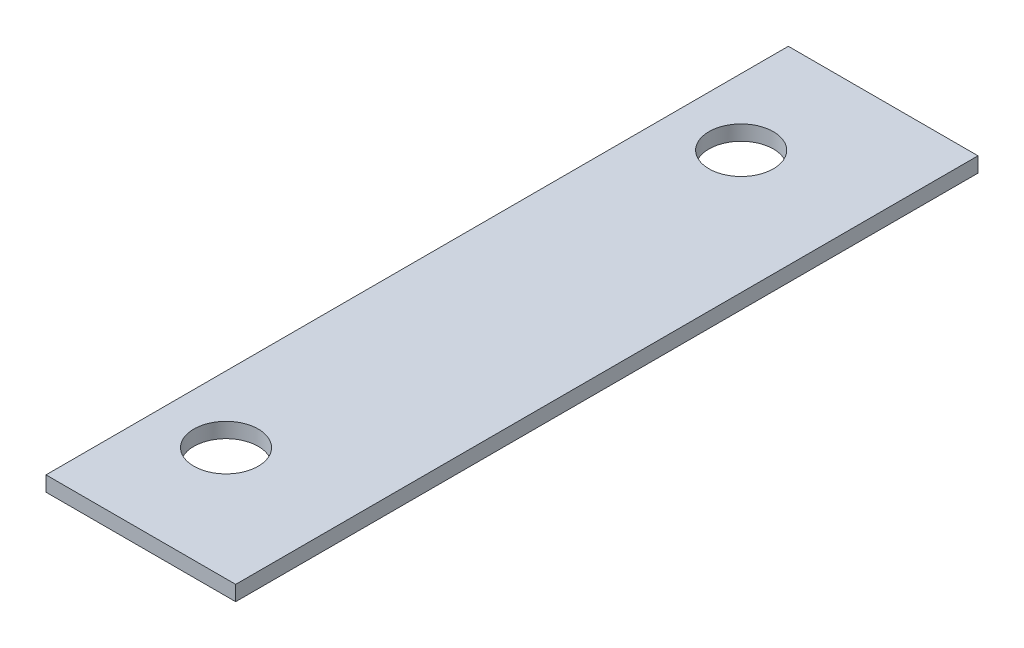
ISO-10303-21;
HEADER;
FILE_DESCRIPTION(('STEP AP214'),'2;1');
FILE_NAME('part.step','',(''),(''),'','','');
FILE_SCHEMA(('AUTOMOTIVE_DESIGN { 1 0 10303 214 1 1 1 1 }'));
ENDSEC;
DATA;
#1=APPLICATION_CONTEXT('core data for automotive mechanical design processes');
#2=APPLICATION_PROTOCOL_DEFINITION('international standard','automotive_design',2000,#1);
#3=PRODUCT_CONTEXT('',#1,'mechanical');
#4=PRODUCT('Part','Part','',(#3));
#5=PRODUCT_RELATED_PRODUCT_CATEGORY('part','',(#4));
#6=PRODUCT_DEFINITION_FORMATION('','',#4);
#7=PRODUCT_DEFINITION_CONTEXT('part definition',#1,'design');
#8=PRODUCT_DEFINITION('design','',#6,#7);
#9=PRODUCT_DEFINITION_SHAPE('','',#8);
#10=(LENGTH_UNIT() NAMED_UNIT(*) SI_UNIT(.MILLI.,.METRE.));
#11=(NAMED_UNIT(*) PLANE_ANGLE_UNIT() SI_UNIT($,.RADIAN.));
#12=(NAMED_UNIT(*) SI_UNIT($,.STERADIAN.) SOLID_ANGLE_UNIT());
#13=UNCERTAINTY_MEASURE_WITH_UNIT(LENGTH_MEASURE(1.E-05),#10,'distance_accuracy_value','');
#14=(GEOMETRIC_REPRESENTATION_CONTEXT(3) GLOBAL_UNCERTAINTY_ASSIGNED_CONTEXT((#13)) GLOBAL_UNIT_ASSIGNED_CONTEXT((#10,
#11,#12)) REPRESENTATION_CONTEXT('',''));
#15=CARTESIAN_POINT('',(0.,0.,0.));
#16=DIRECTION('',(0.,0.,1.));
#17=DIRECTION('',(1.,0.,0.));
#18=AXIS2_PLACEMENT_3D('',#15,#16,#17);
#19=CARTESIAN_POINT('',(0.,0.79375,0.));
#20=DIRECTION('',(1.,0.,0.));
#21=DIRECTION('',(0.,0.,-1.));
#22=AXIS2_PLACEMENT_3D('',#19,#20,#21);
#23=PLANE('',#22);
#24=DIRECTION('',(0.,0.,1.));
#25=VECTOR('',#24,1.);
#26=CARTESIAN_POINT('',(0.,0.,0.));
#27=LINE('',#26,#25);
#28=CARTESIAN_POINT('',(0.,0.,-39.1668));
#29=VERTEX_POINT('',#28);
#30=CARTESIAN_POINT('',(0.,0.,0.));
#31=VERTEX_POINT('',#30);
#32=EDGE_CURVE('E82',#29,#31,#27,.T.);
#33=ORIENTED_EDGE('',*,*,#32,.T.);
#34=DIRECTION('',(0.,-1.,0.));
#35=VECTOR('',#34,1.);
#36=CARTESIAN_POINT('',(0.,0.79375,0.));
#37=LINE('',#36,#35);
#38=CARTESIAN_POINT('',(0.,0.79375,0.));
#39=VERTEX_POINT('',#38);
#40=EDGE_CURVE('E11',#39,#31,#37,.T.);
#41=ORIENTED_EDGE('',*,*,#40,.F.);
#42=DIRECTION('',(0.,0.,1.));
#43=VECTOR('',#42,1.);
#44=CARTESIAN_POINT('',(0.,0.79375,0.));
#45=LINE('',#44,#43);
#46=CARTESIAN_POINT('',(0.,0.79375,-39.1668));
#47=VERTEX_POINT('',#46);
#48=EDGE_CURVE('E69',#47,#39,#45,.T.);
#49=ORIENTED_EDGE('',*,*,#48,.F.);
#50=DIRECTION('',(0.,-1.,0.));
#51=VECTOR('',#50,1.);
#52=CARTESIAN_POINT('',(0.,0.79375,-39.1668));
#53=LINE('',#52,#51);
#54=EDGE_CURVE('E78',#47,#29,#53,.T.);
#55=ORIENTED_EDGE('',*,*,#54,.T.);
#56=EDGE_LOOP('',(#33,#41,#49,#55));
#57=FACE_BOUND('',#56,.T.);
#58=ADVANCED_FACE('F17',(#57),#23,.F.);
#59=CARTESIAN_POINT('',(0.,0.79375,0.));
#60=DIRECTION('',(0.,0.,-1.));
#61=DIRECTION('',(-1.,0.,0.));
#62=AXIS2_PLACEMENT_3D('',#59,#60,#61);
#63=PLANE('',#62);
#64=DIRECTION('',(1.,0.,0.));
#65=VECTOR('',#64,1.);
#66=CARTESIAN_POINT('',(0.,0.,0.));
#67=LINE('',#66,#65);
#68=CARTESIAN_POINT('',(10.0076,0.,0.));
#69=VERTEX_POINT('',#68);
#70=EDGE_CURVE('E73',#31,#69,#67,.T.);
#71=ORIENTED_EDGE('',*,*,#70,.T.);
#72=DIRECTION('',(0.,-1.,0.));
#73=VECTOR('',#72,1.);
#74=CARTESIAN_POINT('',(10.0076,0.79375,0.));
#75=LINE('',#74,#73);
#76=CARTESIAN_POINT('',(10.0076,0.79375,0.));
#77=VERTEX_POINT('',#76);
#78=EDGE_CURVE('E26',#77,#69,#75,.T.);
#79=ORIENTED_EDGE('',*,*,#78,.F.);
#80=DIRECTION('',(1.,0.,0.));
#81=VECTOR('',#80,1.);
#82=CARTESIAN_POINT('',(0.,0.79375,0.));
#83=LINE('',#82,#81);
#84=EDGE_CURVE('E64',#39,#77,#83,.T.);
#85=ORIENTED_EDGE('',*,*,#84,.F.);
#86=ORIENTED_EDGE('',*,*,#40,.T.);
#87=EDGE_LOOP('',(#71,#79,#85,#86));
#88=FACE_BOUND('',#87,.T.);
#89=ADVANCED_FACE('F72',(#88),#63,.F.);
#90=CARTESIAN_POINT('',(10.0076,0.79375,0.));
#91=DIRECTION('',(-1.,0.,0.));
#92=DIRECTION('',(0.,0.,1.));
#93=AXIS2_PLACEMENT_3D('',#90,#91,#92);
#94=PLANE('',#93);
#95=DIRECTION('',(0.,0.,-1.));
#96=VECTOR('',#95,1.);
#97=CARTESIAN_POINT('',(10.0076,0.,0.));
#98=LINE('',#97,#96);
#99=CARTESIAN_POINT('',(10.0076,0.,-39.1668));
#100=VERTEX_POINT('',#99);
#101=EDGE_CURVE('E51',#69,#100,#98,.T.);
#102=ORIENTED_EDGE('',*,*,#101,.T.);
#103=DIRECTION('',(0.,-1.,0.));
#104=VECTOR('',#103,1.);
#105=CARTESIAN_POINT('',(10.0076,0.79375,-39.1668));
#106=LINE('',#105,#104);
#107=CARTESIAN_POINT('',(10.0076,0.79375,-39.1668));
#108=VERTEX_POINT('',#107);
#109=EDGE_CURVE('E74',#108,#100,#106,.T.);
#110=ORIENTED_EDGE('',*,*,#109,.F.);
#111=DIRECTION('',(0.,0.,-1.));
#112=VECTOR('',#111,1.);
#113=CARTESIAN_POINT('',(10.0076,0.79375,0.));
#114=LINE('',#113,#112);
#115=EDGE_CURVE('E67',#77,#108,#114,.T.);
#116=ORIENTED_EDGE('',*,*,#115,.F.);
#117=ORIENTED_EDGE('',*,*,#78,.T.);
#118=EDGE_LOOP('',(#102,#110,#116,#117));
#119=FACE_BOUND('',#118,.T.);
#120=ADVANCED_FACE('F76',(#119),#94,.F.);
#121=CARTESIAN_POINT('',(0.,0.79375,-39.1668));
#122=DIRECTION('',(0.,0.,1.));
#123=DIRECTION('',(1.,0.,0.));
#124=AXIS2_PLACEMENT_3D('',#121,#122,#123);
#125=PLANE('',#124);
#126=DIRECTION('',(-1.,0.,0.));
#127=VECTOR('',#126,1.);
#128=CARTESIAN_POINT('',(0.,0.,-39.1668));
#129=LINE('',#128,#127);
#130=EDGE_CURVE('E57',#100,#29,#129,.T.);
#131=ORIENTED_EDGE('',*,*,#130,.T.);
#132=ORIENTED_EDGE('',*,*,#54,.F.);
#133=DIRECTION('',(-1.,0.,0.));
#134=VECTOR('',#133,1.);
#135=CARTESIAN_POINT('',(0.,0.79375,-39.1668));
#136=LINE('',#135,#134);
#137=EDGE_CURVE('E34',#108,#47,#136,.T.);
#138=ORIENTED_EDGE('',*,*,#137,.F.);
#139=ORIENTED_EDGE('',*,*,#109,.T.);
#140=EDGE_LOOP('',(#131,#132,#138,#139));
#141=FACE_BOUND('',#140,.T.);
#142=ADVANCED_FACE('F90',(#141),#125,.F.);
#143=CARTESIAN_POINT('',(0.,0.79375,0.));
#144=DIRECTION('',(0.,-1.,0.));
#145=DIRECTION('',(0.,0.,-1.));
#146=AXIS2_PLACEMENT_3D('',#143,#144,#145);
#147=PLANE('',#146);
#148=CARTESIAN_POINT('',(3.5052,0.79375,-5.9944));
#149=DIRECTION('',(0.,1.,0.));
#150=DIRECTION('',(0.,0.,1.));
#151=AXIS2_PLACEMENT_3D('',#148,#149,#150);
#152=CIRCLE('',#151,1.7);
#153=CARTESIAN_POINT('',(3.5052,0.79375,-4.2944));
#154=VERTEX_POINT('',#153);
#155=EDGE_CURVE('E101',#154,#154,#152,.T.);
#156=ORIENTED_EDGE('',*,*,#155,.F.);
#157=EDGE_LOOP('',(#156));
#158=FACE_BOUND('',#157,.T.);
#159=CARTESIAN_POINT('',(3.5052,0.79375,-33.1724));
#160=DIRECTION('',(0.,1.,0.));
#161=DIRECTION('',(0.,0.,1.));
#162=AXIS2_PLACEMENT_3D('',#159,#160,#161);
#163=CIRCLE('',#162,1.7);
#164=CARTESIAN_POINT('',(3.5052,0.79375,-31.4724));
#165=VERTEX_POINT('',#164);
#166=EDGE_CURVE('E98',#165,#165,#163,.T.);
#167=ORIENTED_EDGE('',*,*,#166,.F.);
#168=EDGE_LOOP('',(#167));
#169=FACE_BOUND('',#168,.T.);
#170=ORIENTED_EDGE('',*,*,#48,.T.);
#171=ORIENTED_EDGE('',*,*,#84,.T.);
#172=ORIENTED_EDGE('',*,*,#115,.T.);
#173=ORIENTED_EDGE('',*,*,#137,.T.);
#174=EDGE_LOOP('',(#170,#171,#172,#173));
#175=FACE_BOUND('',#174,.T.);
#176=ADVANCED_FACE('F65',(#158,#169,#175),#147,.F.);
#177=CARTESIAN_POINT('',(0.,0.,0.));
#178=DIRECTION('',(0.,-1.,0.));
#179=DIRECTION('',(0.,0.,-1.));
#180=AXIS2_PLACEMENT_3D('',#177,#178,#179);
#181=PLANE('',#180);
#182=CARTESIAN_POINT('',(3.5052,0.,-5.9944));
#183=DIRECTION('',(0.,-1.,0.));
#184=DIRECTION('',(0.,0.,-1.));
#185=AXIS2_PLACEMENT_3D('',#182,#183,#184);
#186=CIRCLE('',#185,1.7);
#187=CARTESIAN_POINT('',(3.5052,0.,-7.6944));
#188=VERTEX_POINT('',#187);
#189=EDGE_CURVE('E20',#188,#188,#186,.T.);
#190=ORIENTED_EDGE('',*,*,#189,.F.);
#191=EDGE_LOOP('',(#190));
#192=FACE_BOUND('',#191,.T.);
#193=CARTESIAN_POINT('',(3.5052,0.,-33.1724));
#194=DIRECTION('',(0.,-1.,0.));
#195=DIRECTION('',(0.,0.,-1.));
#196=AXIS2_PLACEMENT_3D('',#193,#194,#195);
#197=CIRCLE('',#196,1.7);
#198=CARTESIAN_POINT('',(3.5052,0.,-34.8724));
#199=VERTEX_POINT('',#198);
#200=EDGE_CURVE('E85',#199,#199,#197,.T.);
#201=ORIENTED_EDGE('',*,*,#200,.F.);
#202=EDGE_LOOP('',(#201));
#203=FACE_BOUND('',#202,.T.);
#204=ORIENTED_EDGE('',*,*,#32,.F.);
#205=ORIENTED_EDGE('',*,*,#130,.F.);
#206=ORIENTED_EDGE('',*,*,#101,.F.);
#207=ORIENTED_EDGE('',*,*,#70,.F.);
#208=EDGE_LOOP('',(#204,#205,#206,#207));
#209=FACE_BOUND('',#208,.T.);
#210=ADVANCED_FACE('F93',(#192,#203,#209),#181,.T.);
#211=CARTESIAN_POINT('',(3.5052,0.79375,-33.1724));
#212=DIRECTION('',(0.,1.,0.));
#213=DIRECTION('',(0.,0.,1.));
#214=AXIS2_PLACEMENT_3D('',#211,#212,#213);
#215=CYLINDRICAL_SURFACE('',#214,1.7);
#216=ORIENTED_EDGE('',*,*,#200,.T.);
#217=EDGE_LOOP('',(#216));
#218=FACE_BOUND('',#217,.T.);
#219=ORIENTED_EDGE('',*,*,#166,.T.);
#220=EDGE_LOOP('',(#219));
#221=FACE_BOUND('',#220,.T.);
#222=ADVANCED_FACE('F112',(#218,#221),#215,.F.);
#223=CARTESIAN_POINT('',(3.5052,0.79375,-5.9944));
#224=DIRECTION('',(0.,1.,0.));
#225=DIRECTION('',(0.,0.,1.));
#226=AXIS2_PLACEMENT_3D('',#223,#224,#225);
#227=CYLINDRICAL_SURFACE('',#226,1.7);
#228=ORIENTED_EDGE('',*,*,#189,.T.);
#229=EDGE_LOOP('',(#228));
#230=FACE_BOUND('',#229,.T.);
#231=ORIENTED_EDGE('',*,*,#155,.T.);
#232=EDGE_LOOP('',(#231));
#233=FACE_BOUND('',#232,.T.);
#234=ADVANCED_FACE('F108',(#230,#233),#227,.F.);
#235=CLOSED_SHELL('',(#58,#89,#120,#142,#176,#210,#222,#234));
#236=MANIFOLD_SOLID_BREP('B1',#235);
#237=ADVANCED_BREP_SHAPE_REPRESENTATION('',(#18,#236),#14);
#238=SHAPE_DEFINITION_REPRESENTATION(#9,#237);
ENDSEC;
END-ISO-10303-21;
